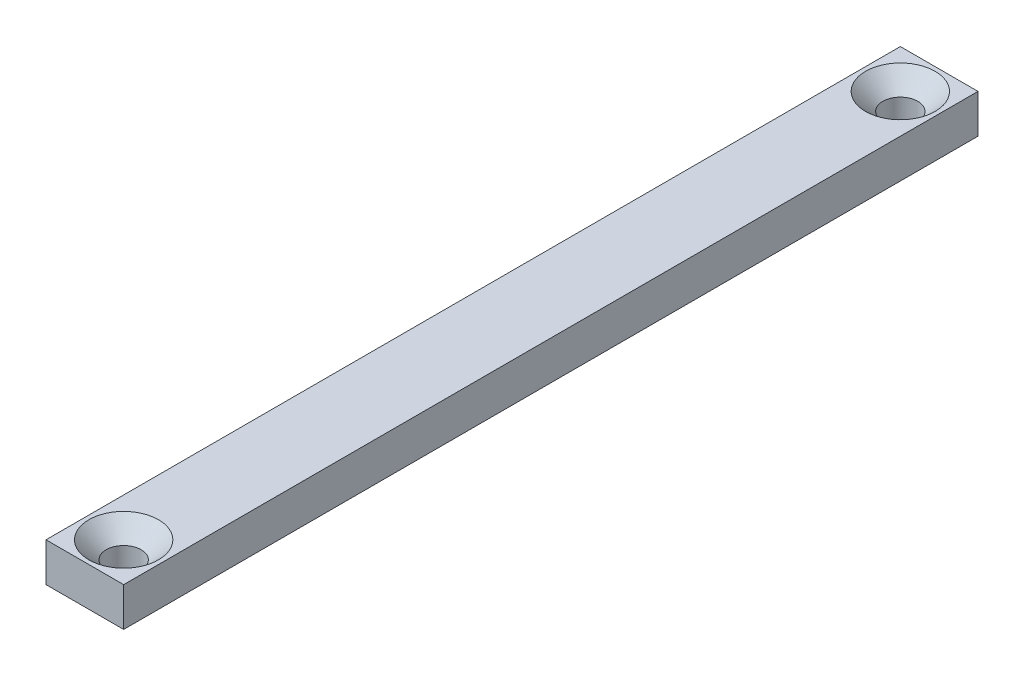
ISO-10303-21;
HEADER;
FILE_DESCRIPTION(('STEP AP214'),'2;1');
FILE_NAME('part.step','',(''),(''),'','','');
FILE_SCHEMA(('AUTOMOTIVE_DESIGN { 1 0 10303 214 1 1 1 1 }'));
ENDSEC;
DATA;
#1=APPLICATION_CONTEXT('core data for automotive mechanical design processes');
#2=APPLICATION_PROTOCOL_DEFINITION('international standard','automotive_design',2000,#1);
#3=PRODUCT_CONTEXT('',#1,'mechanical');
#4=PRODUCT('Part','Part','',(#3));
#5=PRODUCT_RELATED_PRODUCT_CATEGORY('part','',(#4));
#6=PRODUCT_DEFINITION_FORMATION('','',#4);
#7=PRODUCT_DEFINITION_CONTEXT('part definition',#1,'design');
#8=PRODUCT_DEFINITION('design','',#6,#7);
#9=PRODUCT_DEFINITION_SHAPE('','',#8);
#10=(LENGTH_UNIT() NAMED_UNIT(*) SI_UNIT(.MILLI.,.METRE.));
#11=(NAMED_UNIT(*) PLANE_ANGLE_UNIT() SI_UNIT($,.RADIAN.));
#12=(NAMED_UNIT(*) SI_UNIT($,.STERADIAN.) SOLID_ANGLE_UNIT());
#13=UNCERTAINTY_MEASURE_WITH_UNIT(LENGTH_MEASURE(1.E-05),#10,'distance_accuracy_value','');
#14=(GEOMETRIC_REPRESENTATION_CONTEXT(3) GLOBAL_UNCERTAINTY_ASSIGNED_CONTEXT((#13)) GLOBAL_UNIT_ASSIGNED_CONTEXT((#10,
#11,#12)) REPRESENTATION_CONTEXT('',''));
#15=CARTESIAN_POINT('',(0.,0.,0.));
#16=DIRECTION('',(0.,0.,1.));
#17=DIRECTION('',(1.,0.,0.));
#18=AXIS2_PLACEMENT_3D('',#15,#16,#17);
#19=CARTESIAN_POINT('',(5.,5.,55.));
#20=DIRECTION('',(-1.,0.,0.));
#21=DIRECTION('',(0.,0.,1.));
#22=AXIS2_PLACEMENT_3D('',#19,#20,#21);
#23=PLANE('',#22);
#24=DIRECTION('',(0.,0.,-1.));
#25=VECTOR('',#24,1.);
#26=CARTESIAN_POINT('',(5.,0.,55.));
#27=LINE('',#26,#25);
#28=CARTESIAN_POINT('',(5.,0.,55.));
#29=VERTEX_POINT('',#28);
#30=CARTESIAN_POINT('',(5.,0.,-55.));
#31=VERTEX_POINT('',#30);
#32=EDGE_CURVE('E107',#29,#31,#27,.T.);
#33=ORIENTED_EDGE('',*,*,#32,.T.);
#34=DIRECTION('',(0.,-1.,0.));
#35=VECTOR('',#34,1.);
#36=CARTESIAN_POINT('',(5.,5.,-55.));
#37=LINE('',#36,#35);
#38=CARTESIAN_POINT('',(5.,5.,-55.));
#39=VERTEX_POINT('',#38);
#40=EDGE_CURVE('E11',#39,#31,#37,.T.);
#41=ORIENTED_EDGE('',*,*,#40,.F.);
#42=DIRECTION('',(0.,0.,-1.));
#43=VECTOR('',#42,1.);
#44=CARTESIAN_POINT('',(5.,5.,55.));
#45=LINE('',#44,#43);
#46=CARTESIAN_POINT('',(5.,5.,55.));
#47=VERTEX_POINT('',#46);
#48=EDGE_CURVE('E91',#47,#39,#45,.T.);
#49=ORIENTED_EDGE('',*,*,#48,.F.);
#50=DIRECTION('',(0.,-1.,0.));
#51=VECTOR('',#50,1.);
#52=CARTESIAN_POINT('',(5.,5.,55.));
#53=LINE('',#52,#51);
#54=EDGE_CURVE('E103',#47,#29,#53,.T.);
#55=ORIENTED_EDGE('',*,*,#54,.T.);
#56=EDGE_LOOP('',(#33,#41,#49,#55));
#57=FACE_BOUND('',#56,.T.);
#58=ADVANCED_FACE('F39',(#57),#23,.F.);
#59=CARTESIAN_POINT('',(-5.,5.,-55.));
#60=DIRECTION('',(0.,0.,1.));
#61=DIRECTION('',(1.,0.,0.));
#62=AXIS2_PLACEMENT_3D('',#59,#60,#61);
#63=PLANE('',#62);
#64=DIRECTION('',(-1.,0.,0.));
#65=VECTOR('',#64,1.);
#66=CARTESIAN_POINT('',(-5.,0.,-55.));
#67=LINE('',#66,#65);
#68=CARTESIAN_POINT('',(-5.,0.,-55.));
#69=VERTEX_POINT('',#68);
#70=EDGE_CURVE('E96',#31,#69,#67,.T.);
#71=ORIENTED_EDGE('',*,*,#70,.T.);
#72=DIRECTION('',(0.,-1.,0.));
#73=VECTOR('',#72,1.);
#74=CARTESIAN_POINT('',(-5.,5.,-55.));
#75=LINE('',#74,#73);
#76=CARTESIAN_POINT('',(-5.,5.,-55.));
#77=VERTEX_POINT('',#76);
#78=EDGE_CURVE('E48',#77,#69,#75,.T.);
#79=ORIENTED_EDGE('',*,*,#78,.F.);
#80=DIRECTION('',(-1.,0.,0.));
#81=VECTOR('',#80,1.);
#82=CARTESIAN_POINT('',(-5.,5.,-55.));
#83=LINE('',#82,#81);
#84=EDGE_CURVE('E86',#39,#77,#83,.T.);
#85=ORIENTED_EDGE('',*,*,#84,.F.);
#86=ORIENTED_EDGE('',*,*,#40,.T.);
#87=EDGE_LOOP('',(#71,#79,#85,#86));
#88=FACE_BOUND('',#87,.T.);
#89=ADVANCED_FACE('F95',(#88),#63,.F.);
#90=CARTESIAN_POINT('',(-5.,5.,55.));
#91=DIRECTION('',(1.,0.,0.));
#92=DIRECTION('',(0.,0.,-1.));
#93=AXIS2_PLACEMENT_3D('',#90,#91,#92);
#94=PLANE('',#93);
#95=DIRECTION('',(0.,0.,1.));
#96=VECTOR('',#95,1.);
#97=CARTESIAN_POINT('',(-5.,0.,55.));
#98=LINE('',#97,#96);
#99=CARTESIAN_POINT('',(-5.,0.,55.));
#100=VERTEX_POINT('',#99);
#101=EDGE_CURVE('E73',#69,#100,#98,.T.);
#102=ORIENTED_EDGE('',*,*,#101,.T.);
#103=DIRECTION('',(0.,-1.,0.));
#104=VECTOR('',#103,1.);
#105=CARTESIAN_POINT('',(-5.,5.,55.));
#106=LINE('',#105,#104);
#107=CARTESIAN_POINT('',(-5.,5.,55.));
#108=VERTEX_POINT('',#107);
#109=EDGE_CURVE('E98',#108,#100,#106,.T.);
#110=ORIENTED_EDGE('',*,*,#109,.F.);
#111=DIRECTION('',(0.,0.,1.));
#112=VECTOR('',#111,1.);
#113=CARTESIAN_POINT('',(-5.,5.,55.));
#114=LINE('',#113,#112);
#115=EDGE_CURVE('E89',#77,#108,#114,.T.);
#116=ORIENTED_EDGE('',*,*,#115,.F.);
#117=ORIENTED_EDGE('',*,*,#78,.T.);
#118=EDGE_LOOP('',(#102,#110,#116,#117));
#119=FACE_BOUND('',#118,.T.);
#120=ADVANCED_FACE('F99',(#119),#94,.F.);
#121=CARTESIAN_POINT('',(-5.,5.,55.));
#122=DIRECTION('',(0.,0.,-1.));
#123=DIRECTION('',(-1.,0.,0.));
#124=AXIS2_PLACEMENT_3D('',#121,#122,#123);
#125=PLANE('',#124);
#126=DIRECTION('',(1.,0.,0.));
#127=VECTOR('',#126,1.);
#128=CARTESIAN_POINT('',(-5.,0.,55.));
#129=LINE('',#128,#127);
#130=EDGE_CURVE('E79',#100,#29,#129,.T.);
#131=ORIENTED_EDGE('',*,*,#130,.T.);
#132=ORIENTED_EDGE('',*,*,#54,.F.);
#133=DIRECTION('',(1.,0.,0.));
#134=VECTOR('',#133,1.);
#135=CARTESIAN_POINT('',(-5.,5.,55.));
#136=LINE('',#135,#134);
#137=EDGE_CURVE('E56',#108,#47,#136,.T.);
#138=ORIENTED_EDGE('',*,*,#137,.F.);
#139=ORIENTED_EDGE('',*,*,#109,.T.);
#140=EDGE_LOOP('',(#131,#132,#138,#139));
#141=FACE_BOUND('',#140,.T.);
#142=ADVANCED_FACE('F121',(#141),#125,.F.);
#143=CARTESIAN_POINT('',(0.,5.,0.));
#144=DIRECTION('',(0.,-1.,0.));
#145=DIRECTION('',(0.,0.,-1.));
#146=AXIS2_PLACEMENT_3D('',#143,#144,#145);
#147=PLANE('',#146);
#148=CARTESIAN_POINT('',(0.,5.,50.));
#149=DIRECTION('',(0.,1.,0.));
#150=DIRECTION('',(0.,0.,1.));
#151=AXIS2_PLACEMENT_3D('',#148,#149,#150);
#152=CIRCLE('',#151,4.48);
#153=CARTESIAN_POINT('',(0.,5.,54.48));
#154=VERTEX_POINT('',#153);
#155=EDGE_CURVE('E147',#154,#154,#152,.T.);
#156=ORIENTED_EDGE('',*,*,#155,.F.);
#157=EDGE_LOOP('',(#156));
#158=FACE_BOUND('',#157,.T.);
#159=CARTESIAN_POINT('',(0.,5.,-50.));
#160=DIRECTION('',(0.,1.,0.));
#161=DIRECTION('',(0.,0.,1.));
#162=AXIS2_PLACEMENT_3D('',#159,#160,#161);
#163=CIRCLE('',#162,4.48);
#164=CARTESIAN_POINT('',(0.,5.,-45.52));
#165=VERTEX_POINT('',#164);
#166=EDGE_CURVE('E135',#165,#165,#163,.T.);
#167=ORIENTED_EDGE('',*,*,#166,.F.);
#168=EDGE_LOOP('',(#167));
#169=FACE_BOUND('',#168,.T.);
#170=ORIENTED_EDGE('',*,*,#48,.T.);
#171=ORIENTED_EDGE('',*,*,#84,.T.);
#172=ORIENTED_EDGE('',*,*,#115,.T.);
#173=ORIENTED_EDGE('',*,*,#137,.T.);
#174=EDGE_LOOP('',(#170,#171,#172,#173));
#175=FACE_BOUND('',#174,.T.);
#176=ADVANCED_FACE('F87',(#158,#169,#175),#147,.F.);
#177=CARTESIAN_POINT('',(0.,0.,0.));
#178=DIRECTION('',(0.,-1.,0.));
#179=DIRECTION('',(0.,0.,-1.));
#180=AXIS2_PLACEMENT_3D('',#177,#178,#179);
#181=PLANE('',#180);
#182=CARTESIAN_POINT('',(0.,0.,50.));
#183=DIRECTION('',(0.,1.,0.));
#184=DIRECTION('',(0.,0.,1.));
#185=AXIS2_PLACEMENT_3D('',#182,#183,#184);
#186=CIRCLE('',#185,2.25);
#187=CARTESIAN_POINT('',(0.,0.,52.25));
#188=VERTEX_POINT('',#187);
#189=EDGE_CURVE('E139',#188,#188,#186,.T.);
#190=ORIENTED_EDGE('',*,*,#189,.T.);
#191=EDGE_LOOP('',(#190));
#192=FACE_BOUND('',#191,.T.);
#193=CARTESIAN_POINT('',(0.,0.,-50.));
#194=DIRECTION('',(0.,1.,0.));
#195=DIRECTION('',(0.,0.,1.));
#196=AXIS2_PLACEMENT_3D('',#193,#194,#195);
#197=CIRCLE('',#196,2.25);
#198=CARTESIAN_POINT('',(0.,0.,-47.75));
#199=VERTEX_POINT('',#198);
#200=EDGE_CURVE('E111',#199,#199,#197,.T.);
#201=ORIENTED_EDGE('',*,*,#200,.T.);
#202=EDGE_LOOP('',(#201));
#203=FACE_BOUND('',#202,.T.);
#204=ORIENTED_EDGE('',*,*,#32,.F.);
#205=ORIENTED_EDGE('',*,*,#130,.F.);
#206=ORIENTED_EDGE('',*,*,#101,.F.);
#207=ORIENTED_EDGE('',*,*,#70,.F.);
#208=EDGE_LOOP('',(#204,#205,#206,#207));
#209=FACE_BOUND('',#208,.T.);
#210=ADVANCED_FACE('F124',(#192,#203,#209),#181,.T.);
#211=CARTESIAN_POINT('',(0.,5.,-50.));
#212=DIRECTION('',(0.,1.,0.));
#213=DIRECTION('',(0.,0.,1.));
#214=AXIS2_PLACEMENT_3D('',#211,#212,#213);
#215=CYLINDRICAL_SURFACE('',#214,2.25);
#216=ORIENTED_EDGE('',*,*,#200,.F.);
#217=EDGE_LOOP('',(#216));
#218=FACE_BOUND('',#217,.T.);
#219=CARTESIAN_POINT('',(0.,2.77,-50.));
#220=DIRECTION('',(0.,1.,0.));
#221=DIRECTION('',(0.,0.,1.));
#222=AXIS2_PLACEMENT_3D('',#219,#220,#221);
#223=CIRCLE('',#222,2.25);
#224=CARTESIAN_POINT('',(0.,2.77,-47.75));
#225=VERTEX_POINT('',#224);
#226=EDGE_CURVE('E131',#225,#225,#223,.T.);
#227=ORIENTED_EDGE('',*,*,#226,.T.);
#228=EDGE_LOOP('',(#227));
#229=FACE_BOUND('',#228,.T.);
#230=ADVANCED_FACE('F162',(#218,#229),#215,.F.);
#231=CARTESIAN_POINT('',(0.,5.,-50.));
#232=DIRECTION('',(0.,1.,0.));
#233=DIRECTION('',(0.,0.,1.));
#234=AXIS2_PLACEMENT_3D('',#231,#232,#233);
#235=CONICAL_SURFACE('',#234,4.48,0.785398163397448);
#236=ORIENTED_EDGE('',*,*,#226,.F.);
#237=EDGE_LOOP('',(#236));
#238=FACE_BOUND('',#237,.T.);
#239=ORIENTED_EDGE('',*,*,#166,.T.);
#240=EDGE_LOOP('',(#239));
#241=FACE_BOUND('',#240,.T.);
#242=ADVANCED_FACE('F159',(#238,#241),#235,.F.);
#243=CARTESIAN_POINT('',(0.,5.,50.));
#244=DIRECTION('',(0.,1.,0.));
#245=DIRECTION('',(0.,0.,1.));
#246=AXIS2_PLACEMENT_3D('',#243,#244,#245);
#247=CYLINDRICAL_SURFACE('',#246,2.25);
#248=ORIENTED_EDGE('',*,*,#189,.F.);
#249=EDGE_LOOP('',(#248));
#250=FACE_BOUND('',#249,.T.);
#251=CARTESIAN_POINT('',(0.,2.77,50.));
#252=DIRECTION('',(0.,1.,0.));
#253=DIRECTION('',(0.,0.,1.));
#254=AXIS2_PLACEMENT_3D('',#251,#252,#253);
#255=CIRCLE('',#254,2.25);
#256=CARTESIAN_POINT('',(0.,2.77,52.25));
#257=VERTEX_POINT('',#256);
#258=EDGE_CURVE('E143',#257,#257,#255,.T.);
#259=ORIENTED_EDGE('',*,*,#258,.T.);
#260=EDGE_LOOP('',(#259));
#261=FACE_BOUND('',#260,.T.);
#262=ADVANCED_FACE('F161',(#250,#261),#247,.F.);
#263=CARTESIAN_POINT('',(0.,5.,50.));
#264=DIRECTION('',(0.,1.,0.));
#265=DIRECTION('',(0.,0.,1.));
#266=AXIS2_PLACEMENT_3D('',#263,#264,#265);
#267=CONICAL_SURFACE('',#266,4.48,0.785398163397448);
#268=ORIENTED_EDGE('',*,*,#258,.F.);
#269=EDGE_LOOP('',(#268));
#270=FACE_BOUND('',#269,.T.);
#271=ORIENTED_EDGE('',*,*,#155,.T.);
#272=EDGE_LOOP('',(#271));
#273=FACE_BOUND('',#272,.T.);
#274=ADVANCED_FACE('F152',(#270,#273),#267,.F.);
#275=CLOSED_SHELL('',(#58,#89,#120,#142,#176,#210,#230,#242,#262,#274));
#276=MANIFOLD_SOLID_BREP('B2',#275);
#277=ADVANCED_BREP_SHAPE_REPRESENTATION('',(#18,#276),#14);
#278=SHAPE_DEFINITION_REPRESENTATION(#9,#277);
ENDSEC;
END-ISO-10303-21;
